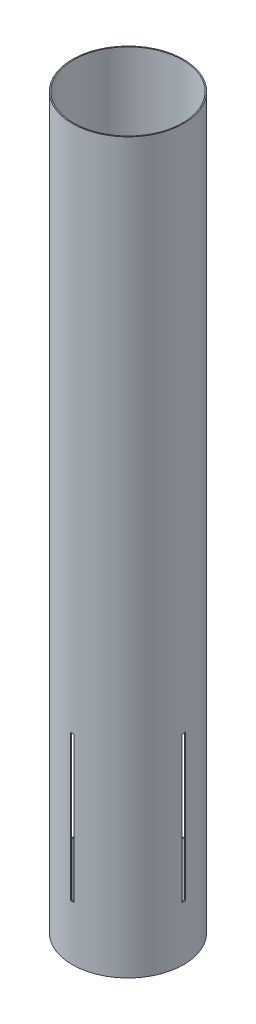
ISO-10303-21;
HEADER;
FILE_DESCRIPTION(('STEP AP214'),'2;1');
FILE_NAME('part.step','',(''),(''),'','','');
FILE_SCHEMA(('AUTOMOTIVE_DESIGN { 1 0 10303 214 1 1 1 1 }'));
ENDSEC;
DATA;
#1=APPLICATION_CONTEXT('core data for automotive mechanical design processes');
#2=APPLICATION_PROTOCOL_DEFINITION('international standard','automotive_design',2000,#1);
#3=PRODUCT_CONTEXT('',#1,'mechanical');
#4=PRODUCT('Part','Part','',(#3));
#5=PRODUCT_RELATED_PRODUCT_CATEGORY('part','',(#4));
#6=PRODUCT_DEFINITION_FORMATION('','',#4);
#7=PRODUCT_DEFINITION_CONTEXT('part definition',#1,'design');
#8=PRODUCT_DEFINITION('design','',#6,#7);
#9=PRODUCT_DEFINITION_SHAPE('','',#8);
#10=(LENGTH_UNIT() NAMED_UNIT(*) SI_UNIT(.MILLI.,.METRE.));
#11=(NAMED_UNIT(*) PLANE_ANGLE_UNIT() SI_UNIT($,.RADIAN.));
#12=(NAMED_UNIT(*) SI_UNIT($,.STERADIAN.) SOLID_ANGLE_UNIT());
#13=UNCERTAINTY_MEASURE_WITH_UNIT(LENGTH_MEASURE(1.E-05),#10,'distance_accuracy_value','');
#14=(GEOMETRIC_REPRESENTATION_CONTEXT(3) GLOBAL_UNCERTAINTY_ASSIGNED_CONTEXT((#13)) GLOBAL_UNIT_ASSIGNED_CONTEXT((#10,
#11,#12)) REPRESENTATION_CONTEXT('',''));
#15=CARTESIAN_POINT('',(0.,0.,0.));
#16=DIRECTION('',(0.,0.,1.));
#17=DIRECTION('',(1.,0.,0.));
#18=AXIS2_PLACEMENT_3D('',#15,#16,#17);
#19=CARTESIAN_POINT('',(0.,508.,0.));
#20=DIRECTION('',(0.,1.,0.));
#21=DIRECTION('',(0.,0.,1.));
#22=AXIS2_PLACEMENT_3D('',#19,#20,#21);
#23=PLANE('',#22);
#24=CARTESIAN_POINT('',(0.,508.,0.));
#25=DIRECTION('',(0.,1.,0.));
#26=DIRECTION('',(0.,0.,1.));
#27=AXIS2_PLACEMENT_3D('',#24,#25,#26);
#28=CIRCLE('',#27,77.6224);
#29=CARTESIAN_POINT('',(0.,508.,77.6224));
#30=VERTEX_POINT('',#29);
#31=EDGE_CURVE('E322',#30,#30,#28,.T.);
#32=ORIENTED_EDGE('',*,*,#31,.T.);
#33=EDGE_LOOP('',(#32));
#34=FACE_BOUND('',#33,.T.);
#35=CARTESIAN_POINT('',(0.,508.,0.));
#36=DIRECTION('',(0.,1.,0.));
#37=DIRECTION('',(0.,0.,1.));
#38=AXIS2_PLACEMENT_3D('',#35,#36,#37);
#39=CIRCLE('',#38,76.2);
#40=CARTESIAN_POINT('',(0.,508.,76.2));
#41=VERTEX_POINT('',#40);
#42=EDGE_CURVE('E314',#41,#41,#39,.T.);
#43=ORIENTED_EDGE('',*,*,#42,.F.);
#44=EDGE_LOOP('',(#43));
#45=FACE_BOUND('',#44,.T.);
#46=ADVANCED_FACE('F39',(#34,#45),#23,.T.);
#47=CARTESIAN_POINT('',(0.,-508.,0.));
#48=DIRECTION('',(0.,1.,0.));
#49=DIRECTION('',(0.,0.,1.));
#50=AXIS2_PLACEMENT_3D('',#47,#48,#49);
#51=PLANE('',#50);
#52=CARTESIAN_POINT('',(0.,-508.,0.));
#53=DIRECTION('',(0.,1.,0.));
#54=DIRECTION('',(0.,0.,1.));
#55=AXIS2_PLACEMENT_3D('',#52,#53,#54);
#56=CIRCLE('',#55,77.6224);
#57=CARTESIAN_POINT('',(0.,-508.,77.6224));
#58=VERTEX_POINT('',#57);
#59=EDGE_CURVE('E318',#58,#58,#56,.T.);
#60=ORIENTED_EDGE('',*,*,#59,.F.);
#61=EDGE_LOOP('',(#60));
#62=FACE_BOUND('',#61,.T.);
#63=CARTESIAN_POINT('',(0.,-508.,0.));
#64=DIRECTION('',(0.,1.,0.));
#65=DIRECTION('',(0.,0.,1.));
#66=AXIS2_PLACEMENT_3D('',#63,#64,#65);
#67=CIRCLE('',#66,76.2);
#68=CARTESIAN_POINT('',(0.,-508.,76.2));
#69=VERTEX_POINT('',#68);
#70=EDGE_CURVE('E313',#69,#69,#67,.T.);
#71=ORIENTED_EDGE('',*,*,#70,.T.);
#72=EDGE_LOOP('',(#71));
#73=FACE_BOUND('',#72,.T.);
#74=ADVANCED_FACE('F372',(#62,#73),#51,.F.);
#75=CARTESIAN_POINT('',(0.,508.,0.));
#76=DIRECTION('',(0.,-1.,0.));
#77=DIRECTION('',(0.,0.,-1.));
#78=AXIS2_PLACEMENT_3D('',#75,#76,#77);
#79=CYLINDRICAL_SURFACE('',#78,77.6224);
#80=DIRECTION('',(0.,-1.,0.));
#81=VECTOR('',#80,1.);
#82=CARTESIAN_POINT('',(-77.586060808305,508.,-2.37489999999973));
#83=LINE('',#82,#81);
#84=CARTESIAN_POINT('',(-77.586060808305,-431.8,-2.37489999999973));
#85=VERTEX_POINT('',#84);
#86=CARTESIAN_POINT('',(-77.586060808305,-228.6,-2.37489999999973));
#87=VERTEX_POINT('',#86);
#88=EDGE_CURVE('E234',#85,#87,#83,.F.);
#89=ORIENTED_EDGE('',*,*,#88,.T.);
#90=CARTESIAN_POINT('',(0.,-228.6,0.));
#91=DIRECTION('',(0.,1.,0.));
#92=DIRECTION('',(0.,0.,1.));
#93=AXIS2_PLACEMENT_3D('',#90,#91,#92);
#94=CIRCLE('',#93,77.6224);
#95=CARTESIAN_POINT('',(-77.586060808305,-228.6,2.37490000000027));
#96=VERTEX_POINT('',#95);
#97=EDGE_CURVE('E55',#87,#96,#94,.T.);
#98=ORIENTED_EDGE('',*,*,#97,.T.);
#99=DIRECTION('',(0.,-1.,0.));
#100=VECTOR('',#99,1.);
#101=CARTESIAN_POINT('',(-77.586060808305,508.,2.37490000000027));
#102=LINE('',#101,#100);
#103=CARTESIAN_POINT('',(-77.586060808305,-431.8,2.37490000000027));
#104=VERTEX_POINT('',#103);
#105=EDGE_CURVE('E246',#96,#104,#102,.T.);
#106=ORIENTED_EDGE('',*,*,#105,.T.);
#107=CARTESIAN_POINT('',(0.,-431.8,0.));
#108=DIRECTION('',(0.,-1.,0.));
#109=DIRECTION('',(0.,0.,-1.));
#110=AXIS2_PLACEMENT_3D('',#107,#108,#109);
#111=CIRCLE('',#110,77.6224);
#112=EDGE_CURVE('E273',#104,#85,#111,.T.);
#113=ORIENTED_EDGE('',*,*,#112,.T.);
#114=EDGE_LOOP('',(#89,#98,#106,#113));
#115=FACE_BOUND('',#114,.T.);
#116=DIRECTION('',(0.,-1.,0.));
#117=VECTOR('',#116,1.);
#118=CARTESIAN_POINT('',(2.3749,508.,77.586060808305));
#119=LINE('',#118,#117);
#120=CARTESIAN_POINT('',(2.3749,-228.6,77.586060808305));
#121=VERTEX_POINT('',#120);
#122=CARTESIAN_POINT('',(2.3749,-431.8,77.586060808305));
#123=VERTEX_POINT('',#122);
#124=EDGE_CURVE('E260',#121,#123,#119,.T.);
#125=ORIENTED_EDGE('',*,*,#124,.T.);
#126=CARTESIAN_POINT('',(-2.3749,-431.8,77.586060808305));
#127=VERTEX_POINT('',#126);
#128=EDGE_CURVE('E277',#123,#127,#111,.T.);
#129=ORIENTED_EDGE('',*,*,#128,.T.);
#130=DIRECTION('',(0.,-1.,0.));
#131=VECTOR('',#130,1.);
#132=CARTESIAN_POINT('',(-2.3749,508.,77.586060808305));
#133=LINE('',#132,#131);
#134=CARTESIAN_POINT('',(-2.3749,-228.6,77.586060808305));
#135=VERTEX_POINT('',#134);
#136=EDGE_CURVE('E264',#127,#135,#133,.F.);
#137=ORIENTED_EDGE('',*,*,#136,.T.);
#138=EDGE_CURVE('E268',#135,#121,#94,.T.);
#139=ORIENTED_EDGE('',*,*,#138,.T.);
#140=EDGE_LOOP('',(#125,#129,#137,#139));
#141=FACE_BOUND('',#140,.T.);
#142=DIRECTION('',(0.,-1.,0.));
#143=VECTOR('',#142,1.);
#144=CARTESIAN_POINT('',(77.586060808305,508.,-2.37490000000027));
#145=LINE('',#144,#143);
#146=CARTESIAN_POINT('',(77.586060808305,-228.6,-2.37490000000027));
#147=VERTEX_POINT('',#146);
#148=CARTESIAN_POINT('',(77.586060808305,-431.8,-2.37490000000027));
#149=VERTEX_POINT('',#148);
#150=EDGE_CURVE('E280',#147,#149,#145,.T.);
#151=ORIENTED_EDGE('',*,*,#150,.T.);
#152=CARTESIAN_POINT('',(77.586060808305,-431.8,2.37489999999919));
#153=VERTEX_POINT('',#152);
#154=EDGE_CURVE('E274',#149,#153,#111,.T.);
#155=ORIENTED_EDGE('',*,*,#154,.T.);
#156=DIRECTION('',(0.,-1.,0.));
#157=VECTOR('',#156,1.);
#158=CARTESIAN_POINT('',(77.586060808305,508.,2.37489999999919));
#159=LINE('',#158,#157);
#160=CARTESIAN_POINT('',(77.586060808305,-228.6,2.37489999999919));
#161=VERTEX_POINT('',#160);
#162=EDGE_CURVE('E236',#153,#161,#159,.F.);
#163=ORIENTED_EDGE('',*,*,#162,.T.);
#164=EDGE_CURVE('E174',#161,#147,#94,.T.);
#165=ORIENTED_EDGE('',*,*,#164,.T.);
#166=EDGE_LOOP('',(#151,#155,#163,#165));
#167=FACE_BOUND('',#166,.T.);
#168=DIRECTION('',(0.,-1.,0.));
#169=VECTOR('',#168,1.);
#170=CARTESIAN_POINT('',(2.3749,508.,-77.586060808305));
#171=LINE('',#170,#169);
#172=CARTESIAN_POINT('',(2.3749,-431.8,-77.586060808305));
#173=VERTEX_POINT('',#172);
#174=CARTESIAN_POINT('',(2.3749,-228.6,-77.586060808305));
#175=VERTEX_POINT('',#174);
#176=EDGE_CURVE('E309',#173,#175,#171,.F.);
#177=ORIENTED_EDGE('',*,*,#176,.T.);
#178=CARTESIAN_POINT('',(0.,-228.6,0.));
#179=DIRECTION('',(0.,1.,0.));
#180=DIRECTION('',(0.,0.,1.));
#181=AXIS2_PLACEMENT_3D('',#178,#179,#180);
#182=CIRCLE('',#181,77.6224);
#183=CARTESIAN_POINT('',(-2.3749,-228.6,-77.586060808305));
#184=VERTEX_POINT('',#183);
#185=EDGE_CURVE('E289',#175,#184,#182,.T.);
#186=ORIENTED_EDGE('',*,*,#185,.T.);
#187=DIRECTION('',(0.,-1.,0.));
#188=VECTOR('',#187,1.);
#189=CARTESIAN_POINT('',(-2.3749,508.,-77.586060808305));
#190=LINE('',#189,#188);
#191=CARTESIAN_POINT('',(-2.3749,-431.8,-77.586060808305));
#192=VERTEX_POINT('',#191);
#193=EDGE_CURVE('E302',#184,#192,#190,.T.);
#194=ORIENTED_EDGE('',*,*,#193,.T.);
#195=CARTESIAN_POINT('',(0.,-431.8,0.));
#196=DIRECTION('',(0.,-1.,0.));
#197=DIRECTION('',(0.,0.,-1.));
#198=AXIS2_PLACEMENT_3D('',#195,#196,#197);
#199=CIRCLE('',#198,77.6224);
#200=EDGE_CURVE('E306',#192,#173,#199,.T.);
#201=ORIENTED_EDGE('',*,*,#200,.T.);
#202=EDGE_LOOP('',(#177,#186,#194,#201));
#203=FACE_BOUND('',#202,.T.);
#204=ORIENTED_EDGE('',*,*,#31,.F.);
#205=EDGE_LOOP('',(#204));
#206=FACE_BOUND('',#205,.T.);
#207=ORIENTED_EDGE('',*,*,#59,.T.);
#208=EDGE_LOOP('',(#207));
#209=FACE_BOUND('',#208,.T.);
#210=ADVANCED_FACE('F41',(#115,#141,#167,#203,#206,#209),#79,.T.);
#211=CARTESIAN_POINT('',(0.,508.,0.));
#212=DIRECTION('',(0.,-1.,0.));
#213=DIRECTION('',(0.,0.,-1.));
#214=AXIS2_PLACEMENT_3D('',#211,#212,#213);
#215=CYLINDRICAL_SURFACE('',#214,76.2);
#216=DIRECTION('',(0.,-1.,0.));
#217=VECTOR('',#216,1.);
#218=CARTESIAN_POINT('',(-76.1629821500577,508.,-2.37489999999973));
#219=LINE('',#218,#217);
#220=CARTESIAN_POINT('',(-76.1629821500577,-431.8,-2.37489999999973));
#221=VERTEX_POINT('',#220);
#222=CARTESIAN_POINT('',(-76.1629821500577,-228.6,-2.37489999999973));
#223=VERTEX_POINT('',#222);
#224=EDGE_CURVE('E11',#221,#223,#219,.F.);
#225=ORIENTED_EDGE('',*,*,#224,.F.);
#226=CARTESIAN_POINT('',(0.,-431.8,0.));
#227=DIRECTION('',(0.,-1.,0.));
#228=DIRECTION('',(0.,0.,-1.));
#229=AXIS2_PLACEMENT_3D('',#226,#227,#228);
#230=CIRCLE('',#229,76.2);
#231=CARTESIAN_POINT('',(-76.1629821500576,-431.8,2.37490000000027));
#232=VERTEX_POINT('',#231);
#233=EDGE_CURVE('E48',#232,#221,#230,.T.);
#234=ORIENTED_EDGE('',*,*,#233,.F.);
#235=DIRECTION('',(0.,-1.,0.));
#236=VECTOR('',#235,1.);
#237=CARTESIAN_POINT('',(-76.1629821500576,508.,2.37490000000027));
#238=LINE('',#237,#236);
#239=CARTESIAN_POINT('',(-76.1629821500576,-228.6,2.37490000000027));
#240=VERTEX_POINT('',#239);
#241=EDGE_CURVE('E192',#240,#232,#238,.T.);
#242=ORIENTED_EDGE('',*,*,#241,.F.);
#243=CARTESIAN_POINT('',(0.,-228.6,0.));
#244=DIRECTION('',(0.,1.,0.));
#245=DIRECTION('',(0.,0.,1.));
#246=AXIS2_PLACEMENT_3D('',#243,#244,#245);
#247=CIRCLE('',#246,76.2);
#248=EDGE_CURVE('E185',#223,#240,#247,.T.);
#249=ORIENTED_EDGE('',*,*,#248,.F.);
#250=EDGE_LOOP('',(#225,#234,#242,#249));
#251=FACE_BOUND('',#250,.T.);
#252=DIRECTION('',(0.,-1.,0.));
#253=VECTOR('',#252,1.);
#254=CARTESIAN_POINT('',(-2.3749,508.,76.1629821500576));
#255=LINE('',#254,#253);
#256=CARTESIAN_POINT('',(-2.3749,-431.8,76.1629821500576));
#257=VERTEX_POINT('',#256);
#258=CARTESIAN_POINT('',(-2.3749,-228.6,76.1629821500576));
#259=VERTEX_POINT('',#258);
#260=EDGE_CURVE('E193',#257,#259,#255,.F.);
#261=ORIENTED_EDGE('',*,*,#260,.F.);
#262=CARTESIAN_POINT('',(2.3749,-431.8,76.1629821500576));
#263=VERTEX_POINT('',#262);
#264=EDGE_CURVE('E190',#263,#257,#230,.T.);
#265=ORIENTED_EDGE('',*,*,#264,.F.);
#266=DIRECTION('',(0.,-1.,0.));
#267=VECTOR('',#266,1.);
#268=CARTESIAN_POINT('',(2.3749,508.,76.1629821500576));
#269=LINE('',#268,#267);
#270=CARTESIAN_POINT('',(2.3749,-228.6,76.1629821500576));
#271=VERTEX_POINT('',#270);
#272=EDGE_CURVE('E196',#271,#263,#269,.T.);
#273=ORIENTED_EDGE('',*,*,#272,.F.);
#274=EDGE_CURVE('E186',#259,#271,#247,.T.);
#275=ORIENTED_EDGE('',*,*,#274,.F.);
#276=EDGE_LOOP('',(#261,#265,#273,#275));
#277=FACE_BOUND('',#276,.T.);
#278=DIRECTION('',(0.,-1.,0.));
#279=VECTOR('',#278,1.);
#280=CARTESIAN_POINT('',(76.1629821500576,508.,-2.37490000000027));
#281=LINE('',#280,#279);
#282=CARTESIAN_POINT('',(76.1629821500576,-228.6,-2.37490000000027));
#283=VERTEX_POINT('',#282);
#284=CARTESIAN_POINT('',(76.1629821500576,-431.8,-2.37490000000027));
#285=VERTEX_POINT('',#284);
#286=EDGE_CURVE('E181',#283,#285,#281,.T.);
#287=ORIENTED_EDGE('',*,*,#286,.F.);
#288=CARTESIAN_POINT('',(76.1629821500577,-228.6,2.3748999999992));
#289=VERTEX_POINT('',#288);
#290=EDGE_CURVE('E167',#289,#283,#247,.T.);
#291=ORIENTED_EDGE('',*,*,#290,.F.);
#292=DIRECTION('',(0.,-1.,0.));
#293=VECTOR('',#292,1.);
#294=CARTESIAN_POINT('',(76.1629821500577,508.,2.3748999999992));
#295=LINE('',#294,#293);
#296=CARTESIAN_POINT('',(76.1629821500577,-431.8,2.3748999999992));
#297=VERTEX_POINT('',#296);
#298=EDGE_CURVE('E154',#297,#289,#295,.F.);
#299=ORIENTED_EDGE('',*,*,#298,.F.);
#300=EDGE_CURVE('E183',#285,#297,#230,.T.);
#301=ORIENTED_EDGE('',*,*,#300,.F.);
#302=EDGE_LOOP('',(#287,#291,#299,#301));
#303=FACE_BOUND('',#302,.T.);
#304=DIRECTION('',(0.,-1.,0.));
#305=VECTOR('',#304,1.);
#306=CARTESIAN_POINT('',(2.3749,508.,-76.1629821500576));
#307=LINE('',#306,#305);
#308=CARTESIAN_POINT('',(2.3749,-431.8,-76.1629821500576));
#309=VERTEX_POINT('',#308);
#310=CARTESIAN_POINT('',(2.3749,-228.6,-76.1629821500576));
#311=VERTEX_POINT('',#310);
#312=EDGE_CURVE('E168',#309,#311,#307,.F.);
#313=ORIENTED_EDGE('',*,*,#312,.F.);
#314=CARTESIAN_POINT('',(0.,-431.8,0.));
#315=DIRECTION('',(0.,-1.,0.));
#316=DIRECTION('',(0.,0.,-1.));
#317=AXIS2_PLACEMENT_3D('',#314,#315,#316);
#318=CIRCLE('',#317,76.2);
#319=CARTESIAN_POINT('',(-2.3749,-431.8,-76.1629821500576));
#320=VERTEX_POINT('',#319);
#321=EDGE_CURVE('E335',#320,#309,#318,.T.);
#322=ORIENTED_EDGE('',*,*,#321,.F.);
#323=DIRECTION('',(0.,-1.,0.));
#324=VECTOR('',#323,1.);
#325=CARTESIAN_POINT('',(-2.3749,508.,-76.1629821500576));
#326=LINE('',#325,#324);
#327=CARTESIAN_POINT('',(-2.3749,-228.6,-76.1629821500576));
#328=VERTEX_POINT('',#327);
#329=EDGE_CURVE('E332',#328,#320,#326,.T.);
#330=ORIENTED_EDGE('',*,*,#329,.F.);
#331=CARTESIAN_POINT('',(0.,-228.6,0.));
#332=DIRECTION('',(0.,1.,0.));
#333=DIRECTION('',(0.,0.,1.));
#334=AXIS2_PLACEMENT_3D('',#331,#332,#333);
#335=CIRCLE('',#334,76.2);
#336=EDGE_CURVE('E326',#311,#328,#335,.T.);
#337=ORIENTED_EDGE('',*,*,#336,.F.);
#338=EDGE_LOOP('',(#313,#322,#330,#337));
#339=FACE_BOUND('',#338,.T.);
#340=ORIENTED_EDGE('',*,*,#42,.T.);
#341=EDGE_LOOP('',(#340));
#342=FACE_BOUND('',#341,.T.);
#343=ORIENTED_EDGE('',*,*,#70,.F.);
#344=EDGE_LOOP('',(#343));
#345=FACE_BOUND('',#344,.T.);
#346=ADVANCED_FACE('F179',(#251,#277,#303,#339,#342,#345),#215,.F.);
#347=CARTESIAN_POINT('',(2.3749,-431.8,-77.6224));
#348=DIRECTION('',(1.,0.,0.));
#349=DIRECTION('',(0.,0.,-1.));
#350=AXIS2_PLACEMENT_3D('',#347,#348,#349);
#351=PLANE('',#350);
#352=DIRECTION('',(0.,0.,1.));
#353=VECTOR('',#352,1.);
#354=CARTESIAN_POINT('',(2.3749,-431.8,-77.6224));
#355=LINE('',#354,#353);
#356=EDGE_CURVE('E285',#173,#309,#355,.T.);
#357=ORIENTED_EDGE('',*,*,#356,.T.);
#358=ORIENTED_EDGE('',*,*,#312,.T.);
#359=DIRECTION('',(0.,0.,1.));
#360=VECTOR('',#359,1.);
#361=CARTESIAN_POINT('',(2.3749,-228.6,-77.6224));
#362=LINE('',#361,#360);
#363=EDGE_CURVE('E284',#175,#311,#362,.T.);
#364=ORIENTED_EDGE('',*,*,#363,.F.);
#365=ORIENTED_EDGE('',*,*,#176,.F.);
#366=EDGE_LOOP('',(#357,#358,#364,#365));
#367=FACE_BOUND('',#366,.T.);
#368=ADVANCED_FACE('F345',(#367),#351,.F.);
#369=CARTESIAN_POINT('',(-2.3749,-431.8,-77.6224));
#370=DIRECTION('',(0.,-1.,0.));
#371=DIRECTION('',(0.,0.,-1.));
#372=AXIS2_PLACEMENT_3D('',#369,#370,#371);
#373=PLANE('',#372);
#374=ORIENTED_EDGE('',*,*,#200,.F.);
#375=DIRECTION('',(0.,0.,1.));
#376=VECTOR('',#375,1.);
#377=CARTESIAN_POINT('',(-2.3749,-431.8,-77.6224));
#378=LINE('',#377,#376);
#379=EDGE_CURVE('E290',#192,#320,#378,.T.);
#380=ORIENTED_EDGE('',*,*,#379,.T.);
#381=ORIENTED_EDGE('',*,*,#321,.T.);
#382=ORIENTED_EDGE('',*,*,#356,.F.);
#383=EDGE_LOOP('',(#374,#380,#381,#382));
#384=FACE_BOUND('',#383,.T.);
#385=ADVANCED_FACE('F361',(#384),#373,.F.);
#386=CARTESIAN_POINT('',(-2.3749,-431.8,-77.6224));
#387=DIRECTION('',(-1.,0.,0.));
#388=DIRECTION('',(0.,0.,1.));
#389=AXIS2_PLACEMENT_3D('',#386,#387,#388);
#390=PLANE('',#389);
#391=DIRECTION('',(0.,0.,1.));
#392=VECTOR('',#391,1.);
#393=CARTESIAN_POINT('',(-2.3749,-228.6,-77.6224));
#394=LINE('',#393,#392);
#395=EDGE_CURVE('E294',#184,#328,#394,.T.);
#396=ORIENTED_EDGE('',*,*,#395,.T.);
#397=ORIENTED_EDGE('',*,*,#329,.T.);
#398=ORIENTED_EDGE('',*,*,#379,.F.);
#399=ORIENTED_EDGE('',*,*,#193,.F.);
#400=EDGE_LOOP('',(#396,#397,#398,#399));
#401=FACE_BOUND('',#400,.T.);
#402=ADVANCED_FACE('F356',(#401),#390,.F.);
#403=CARTESIAN_POINT('',(-2.3749,-228.6,-77.6224));
#404=DIRECTION('',(0.,1.,0.));
#405=DIRECTION('',(0.,0.,1.));
#406=AXIS2_PLACEMENT_3D('',#403,#404,#405);
#407=PLANE('',#406);
#408=ORIENTED_EDGE('',*,*,#363,.T.);
#409=ORIENTED_EDGE('',*,*,#336,.T.);
#410=ORIENTED_EDGE('',*,*,#395,.F.);
#411=ORIENTED_EDGE('',*,*,#185,.F.);
#412=EDGE_LOOP('',(#408,#409,#410,#411));
#413=FACE_BOUND('',#412,.T.);
#414=ADVANCED_FACE('F353',(#413),#407,.F.);
#415=CARTESIAN_POINT('',(77.6224000000008,-431.8,2.37489999999919));
#416=DIRECTION('',(0.,0.,1.));
#417=DIRECTION('',(1.,0.,0.));
#418=AXIS2_PLACEMENT_3D('',#415,#416,#417);
#419=PLANE('',#418);
#420=DIRECTION('',(-1.,0.,0.));
#421=VECTOR('',#420,1.);
#422=CARTESIAN_POINT('',(77.6224000000008,-431.8,2.37489999999919));
#423=LINE('',#422,#421);
#424=EDGE_CURVE('E161',#153,#297,#423,.T.);
#425=ORIENTED_EDGE('',*,*,#424,.T.);
#426=ORIENTED_EDGE('',*,*,#298,.T.);
#427=DIRECTION('',(-1.,0.,0.));
#428=VECTOR('',#427,1.);
#429=CARTESIAN_POINT('',(77.6224000000008,-228.6,2.37489999999919));
#430=LINE('',#429,#428);
#431=EDGE_CURVE('E158',#161,#289,#430,.T.);
#432=ORIENTED_EDGE('',*,*,#431,.F.);
#433=ORIENTED_EDGE('',*,*,#162,.F.);
#434=EDGE_LOOP('',(#425,#426,#432,#433));
#435=FACE_BOUND('',#434,.T.);
#436=ADVANCED_FACE('F156',(#435),#419,.F.);
#437=CARTESIAN_POINT('',(-77.6224000000003,-228.6,2.37490000000027));
#438=DIRECTION('',(0.,1.,0.));
#439=DIRECTION('',(0.,0.,1.));
#440=AXIS2_PLACEMENT_3D('',#437,#438,#439);
#441=PLANE('',#440);
#442=ORIENTED_EDGE('',*,*,#431,.T.);
#443=ORIENTED_EDGE('',*,*,#290,.T.);
#444=DIRECTION('',(1.,0.,0.));
#445=VECTOR('',#444,1.);
#446=CARTESIAN_POINT('',(-77.6224000000003,-228.6,-2.37489999999973));
#447=LINE('',#446,#445);
#448=EDGE_CURVE('E253',#283,#147,#447,.T.);
#449=ORIENTED_EDGE('',*,*,#448,.T.);
#450=ORIENTED_EDGE('',*,*,#164,.F.);
#451=EDGE_LOOP('',(#442,#443,#449,#450));
#452=FACE_BOUND('',#451,.T.);
#453=ADVANCED_FACE('F171',(#452),#441,.F.);
#454=CARTESIAN_POINT('',(-77.6224000000003,-431.8,2.37490000000027));
#455=DIRECTION('',(0.,-1.,0.));
#456=DIRECTION('',(0.,0.,-1.));
#457=AXIS2_PLACEMENT_3D('',#454,#455,#456);
#458=PLANE('',#457);
#459=DIRECTION('',(1.,0.,0.));
#460=VECTOR('',#459,1.);
#461=CARTESIAN_POINT('',(-77.6224000000003,-431.8,-2.37489999999973));
#462=LINE('',#461,#460);
#463=EDGE_CURVE('E237',#285,#149,#462,.T.);
#464=ORIENTED_EDGE('',*,*,#463,.F.);
#465=ORIENTED_EDGE('',*,*,#300,.T.);
#466=ORIENTED_EDGE('',*,*,#424,.F.);
#467=ORIENTED_EDGE('',*,*,#154,.F.);
#468=EDGE_LOOP('',(#464,#465,#466,#467));
#469=FACE_BOUND('',#468,.T.);
#470=ADVANCED_FACE('F391',(#469),#458,.F.);
#471=CARTESIAN_POINT('',(-77.6224000000003,-431.8,-2.37489999999973));
#472=DIRECTION('',(0.,0.,-1.));
#473=DIRECTION('',(-1.,0.,0.));
#474=AXIS2_PLACEMENT_3D('',#471,#472,#473);
#475=PLANE('',#474);
#476=ORIENTED_EDGE('',*,*,#448,.F.);
#477=ORIENTED_EDGE('',*,*,#286,.T.);
#478=ORIENTED_EDGE('',*,*,#463,.T.);
#479=ORIENTED_EDGE('',*,*,#150,.F.);
#480=EDGE_LOOP('',(#476,#477,#478,#479));
#481=FACE_BOUND('',#480,.T.);
#482=ADVANCED_FACE('F401',(#481),#475,.F.);
#483=CARTESIAN_POINT('',(-2.3749,-431.8,77.6224));
#484=DIRECTION('',(-1.,0.,0.));
#485=DIRECTION('',(0.,0.,1.));
#486=AXIS2_PLACEMENT_3D('',#483,#484,#485);
#487=PLANE('',#486);
#488=DIRECTION('',(0.,0.,-1.));
#489=VECTOR('',#488,1.);
#490=CARTESIAN_POINT('',(-2.3749,-431.8,77.6224));
#491=LINE('',#490,#489);
#492=EDGE_CURVE('E257',#127,#257,#491,.T.);
#493=ORIENTED_EDGE('',*,*,#492,.T.);
#494=ORIENTED_EDGE('',*,*,#260,.T.);
#495=DIRECTION('',(0.,0.,-1.));
#496=VECTOR('',#495,1.);
#497=CARTESIAN_POINT('',(-2.3749,-228.6,77.6224));
#498=LINE('',#497,#496);
#499=EDGE_CURVE('E430',#135,#259,#498,.T.);
#500=ORIENTED_EDGE('',*,*,#499,.F.);
#501=ORIENTED_EDGE('',*,*,#136,.F.);
#502=EDGE_LOOP('',(#493,#494,#500,#501));
#503=FACE_BOUND('',#502,.T.);
#504=ADVANCED_FACE('F398',(#503),#487,.F.);
#505=CARTESIAN_POINT('',(2.3749,-431.8,77.6224));
#506=DIRECTION('',(1.,0.,0.));
#507=DIRECTION('',(0.,0.,-1.));
#508=AXIS2_PLACEMENT_3D('',#505,#506,#507);
#509=PLANE('',#508);
#510=DIRECTION('',(0.,0.,-1.));
#511=VECTOR('',#510,1.);
#512=CARTESIAN_POINT('',(2.3749,-228.6,77.6224));
#513=LINE('',#512,#511);
#514=EDGE_CURVE('E425',#121,#271,#513,.T.);
#515=ORIENTED_EDGE('',*,*,#514,.T.);
#516=ORIENTED_EDGE('',*,*,#272,.T.);
#517=DIRECTION('',(0.,0.,-1.));
#518=VECTOR('',#517,1.);
#519=CARTESIAN_POINT('',(2.3749,-431.8,77.6224));
#520=LINE('',#519,#518);
#521=EDGE_CURVE('E63',#123,#263,#520,.T.);
#522=ORIENTED_EDGE('',*,*,#521,.F.);
#523=ORIENTED_EDGE('',*,*,#124,.F.);
#524=EDGE_LOOP('',(#515,#516,#522,#523));
#525=FACE_BOUND('',#524,.T.);
#526=ADVANCED_FACE('F395',(#525),#509,.F.);
#527=ORIENTED_EDGE('',*,*,#138,.F.);
#528=ORIENTED_EDGE('',*,*,#499,.T.);
#529=ORIENTED_EDGE('',*,*,#274,.T.);
#530=ORIENTED_EDGE('',*,*,#514,.F.);
#531=EDGE_LOOP('',(#527,#528,#529,#530));
#532=FACE_BOUND('',#531,.T.);
#533=ADVANCED_FACE('F393',(#532),#441,.F.);
#534=ORIENTED_EDGE('',*,*,#521,.T.);
#535=ORIENTED_EDGE('',*,*,#264,.T.);
#536=ORIENTED_EDGE('',*,*,#492,.F.);
#537=ORIENTED_EDGE('',*,*,#128,.F.);
#538=EDGE_LOOP('',(#534,#535,#536,#537));
#539=FACE_BOUND('',#538,.T.);
#540=ADVANCED_FACE('F406',(#539),#458,.F.);
#541=EDGE_CURVE('E225',#85,#221,#462,.T.);
#542=ORIENTED_EDGE('',*,*,#541,.T.);
#543=ORIENTED_EDGE('',*,*,#224,.T.);
#544=EDGE_CURVE('E244',#87,#223,#447,.T.);
#545=ORIENTED_EDGE('',*,*,#544,.F.);
#546=ORIENTED_EDGE('',*,*,#88,.F.);
#547=EDGE_LOOP('',(#542,#543,#545,#546));
#548=FACE_BOUND('',#547,.T.);
#549=ADVANCED_FACE('F231',(#548),#475,.F.);
#550=DIRECTION('',(1.,0.,0.));
#551=VECTOR('',#550,1.);
#552=CARTESIAN_POINT('',(-77.6224000000003,-431.8,2.37490000000027));
#553=LINE('',#552,#551);
#554=EDGE_CURVE('E226',#104,#232,#553,.T.);
#555=ORIENTED_EDGE('',*,*,#554,.T.);
#556=ORIENTED_EDGE('',*,*,#233,.T.);
#557=ORIENTED_EDGE('',*,*,#541,.F.);
#558=ORIENTED_EDGE('',*,*,#112,.F.);
#559=EDGE_LOOP('',(#555,#556,#557,#558));
#560=FACE_BOUND('',#559,.T.);
#561=ADVANCED_FACE('F224',(#560),#458,.F.);
#562=CARTESIAN_POINT('',(-77.6224000000003,-431.8,2.37490000000027));
#563=DIRECTION('',(0.,0.,1.));
#564=DIRECTION('',(1.,0.,0.));
#565=AXIS2_PLACEMENT_3D('',#562,#563,#564);
#566=PLANE('',#565);
#567=DIRECTION('',(1.,0.,0.));
#568=VECTOR('',#567,1.);
#569=CARTESIAN_POINT('',(-77.6224000000003,-228.6,2.37490000000027));
#570=LINE('',#569,#568);
#571=EDGE_CURVE('E242',#96,#240,#570,.T.);
#572=ORIENTED_EDGE('',*,*,#571,.T.);
#573=ORIENTED_EDGE('',*,*,#241,.T.);
#574=ORIENTED_EDGE('',*,*,#554,.F.);
#575=ORIENTED_EDGE('',*,*,#105,.F.);
#576=EDGE_LOOP('',(#572,#573,#574,#575));
#577=FACE_BOUND('',#576,.T.);
#578=ADVANCED_FACE('F245',(#577),#566,.F.);
#579=ORIENTED_EDGE('',*,*,#544,.T.);
#580=ORIENTED_EDGE('',*,*,#248,.T.);
#581=ORIENTED_EDGE('',*,*,#571,.F.);
#582=ORIENTED_EDGE('',*,*,#97,.F.);
#583=EDGE_LOOP('',(#579,#580,#581,#582));
#584=FACE_BOUND('',#583,.T.);
#585=ADVANCED_FACE('F241',(#584),#441,.F.);
#586=CLOSED_SHELL('',(#46,#74,#210,#346,#368,#385,#402,#414,#436,#453,#470,#482,#504,#526,#533,
#540,#549,#561,#578,#585));
#587=MANIFOLD_SOLID_BREP('B2',#586);
#588=ADVANCED_BREP_SHAPE_REPRESENTATION('',(#18,#587),#14);
#589=SHAPE_DEFINITION_REPRESENTATION(#9,#588);
ENDSEC;
END-ISO-10303-21;
